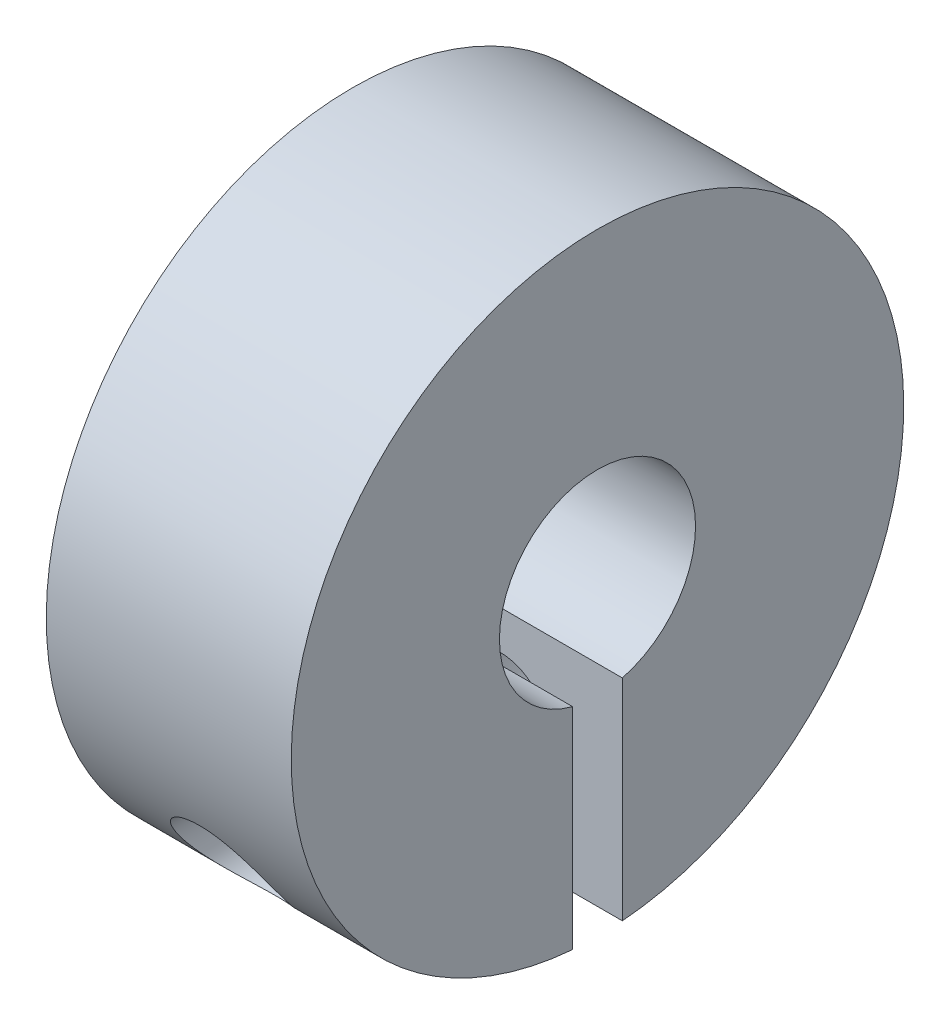
ISO-10303-21;
HEADER;
FILE_DESCRIPTION(('STEP AP214'),'2;1');
FILE_NAME('part.step','',(''),(''),'','','');
FILE_SCHEMA(('AUTOMOTIVE_DESIGN { 1 0 10303 214 1 1 1 1 }'));
ENDSEC;
DATA;
#1=APPLICATION_CONTEXT('core data for automotive mechanical design processes');
#2=APPLICATION_PROTOCOL_DEFINITION('international standard','automotive_design',2000,#1);
#3=PRODUCT_CONTEXT('',#1,'mechanical');
#4=PRODUCT('Part','Part','',(#3));
#5=PRODUCT_RELATED_PRODUCT_CATEGORY('part','',(#4));
#6=PRODUCT_DEFINITION_FORMATION('','',#4);
#7=PRODUCT_DEFINITION_CONTEXT('part definition',#1,'design');
#8=PRODUCT_DEFINITION('design','',#6,#7);
#9=PRODUCT_DEFINITION_SHAPE('','',#8);
#10=(LENGTH_UNIT() NAMED_UNIT(*) SI_UNIT(.MILLI.,.METRE.));
#11=(NAMED_UNIT(*) PLANE_ANGLE_UNIT() SI_UNIT($,.RADIAN.));
#12=(NAMED_UNIT(*) SI_UNIT($,.STERADIAN.) SOLID_ANGLE_UNIT());
#13=UNCERTAINTY_MEASURE_WITH_UNIT(LENGTH_MEASURE(1.E-05),#10,'distance_accuracy_value','');
#14=(GEOMETRIC_REPRESENTATION_CONTEXT(3) GLOBAL_UNCERTAINTY_ASSIGNED_CONTEXT((#13)) GLOBAL_UNIT_ASSIGNED_CONTEXT((#10,
#11,#12)) REPRESENTATION_CONTEXT('',''));
#15=CARTESIAN_POINT('',(0.,0.,0.));
#16=DIRECTION('',(0.,0.,1.));
#17=DIRECTION('',(1.,0.,0.));
#18=AXIS2_PLACEMENT_3D('',#15,#16,#17);
#19=CARTESIAN_POINT('',(51.5000099997895,-253.871175163599,-482.846759050819));
#20=DIRECTION('',(-3.8208128042193E-13,0.,-1.));
#21=DIRECTION('',(1.,0.,-3.8208128042193E-13));
#22=AXIS2_PLACEMENT_3D('',#19,#20,#21);
#23=PLANE('',#22);
#24=CARTESIAN_POINT('',(56.5000099997896,-257.458692421678,-482.846759050821));
#25=DIRECTION('',(3.8208128042193E-13,0.,1.));
#26=DIRECTION('',(1.,0.,-3.8208128042193E-13));
#27=AXIS2_PLACEMENT_3D('',#24,#25,#26);
#28=CIRCLE('',#27,2.);
#29=CARTESIAN_POINT('',(58.5000099997896,-257.458692421678,-482.846759050822));
#30=VERTEX_POINT('',#29);
#31=EDGE_CURVE('E102',#30,#30,#28,.T.);
#32=ORIENTED_EDGE('',*,*,#31,.F.);
#33=EDGE_LOOP('',(#32));
#34=FACE_BOUND('',#33,.T.);
#35=DIRECTION('',(0.,-1.,0.));
#36=VECTOR('',#35,1.);
#37=CARTESIAN_POINT('',(61.5000099997895,-253.871175163599,-482.846759050823));
#38=LINE('',#37,#36);
#39=CARTESIAN_POINT('',(61.5000099997895,-253.871175163599,-482.846759050823));
#40=VERTEX_POINT('',#39);
#41=CARTESIAN_POINT('',(61.5000099997895,-262.458692421678,-482.846759050823));
#42=VERTEX_POINT('',#41);
#43=EDGE_CURVE('E99',#40,#42,#38,.T.);
#44=ORIENTED_EDGE('',*,*,#43,.F.);
#45=DIRECTION('',(1.,0.,-3.8208128042193E-13));
#46=VECTOR('',#45,1.);
#47=CARTESIAN_POINT('',(51.5000099997895,-253.871175163599,-482.846759050819));
#48=LINE('',#47,#46);
#49=CARTESIAN_POINT('',(51.5000099997895,-253.871175163599,-482.846759050819));
#50=VERTEX_POINT('',#49);
#51=EDGE_CURVE('E98',#50,#40,#48,.T.);
#52=ORIENTED_EDGE('',*,*,#51,.F.);
#53=DIRECTION('',(0.,-1.,0.));
#54=VECTOR('',#53,1.);
#55=CARTESIAN_POINT('',(51.5000099997895,-253.871175163599,-482.846759050819));
#56=LINE('',#55,#54);
#57=CARTESIAN_POINT('',(51.5000099997895,-262.458692421678,-482.846759050819));
#58=VERTEX_POINT('',#57);
#59=EDGE_CURVE('E92',#50,#58,#56,.T.);
#60=ORIENTED_EDGE('',*,*,#59,.T.);
#61=DIRECTION('',(1.,0.,-3.8208128042193E-13));
#62=VECTOR('',#61,1.);
#63=CARTESIAN_POINT('',(51.5000099997895,-262.458692421678,-482.846759050819));
#64=LINE('',#63,#62);
#65=EDGE_CURVE('E11',#58,#42,#64,.T.);
#66=ORIENTED_EDGE('',*,*,#65,.T.);
#67=EDGE_LOOP('',(#44,#52,#60,#66));
#68=FACE_BOUND('',#67,.T.);
#69=ADVANCED_FACE('F33',(#34,#68),#23,.F.);
#70=CARTESIAN_POINT('',(51.50000999979,-249.999999999978,-481.831385650802));
#71=DIRECTION('',(1.,0.,-3.8208128042193E-13));
#72=DIRECTION('',(3.8208128042193E-13,0.,1.));
#73=AXIS2_PLACEMENT_3D('',#70,#71,#72);
#74=CYLINDRICAL_SURFACE('',#73,12.5);
#75=CARTESIAN_POINT('',(58.5000099997939,-257.458692421678,-471.800537862185));
#76=CARTESIAN_POINT('',(58.5000091417753,-257.32202750186,-471.698923568416));
#77=CARTESIAN_POINT('',(58.4860098511298,-257.183085527309,-471.599985504261));
#78=CARTESIAN_POINT('',(58.4272314805146,-256.905626388847,-471.410710924294));
#79=CARTESIAN_POINT('',(58.3824573498908,-256.767109160224,-471.320373028025));
#80=CARTESIAN_POINT('',(58.2764477658024,-256.533454967331,-471.174103158506));
#81=CARTESIAN_POINT('',(58.2227808496656,-256.436596202806,-471.115418564901));
#82=CARTESIAN_POINT('',(58.0976314885378,-256.250319013153,-471.005714397012));
#83=CARTESIAN_POINT('',(58.0261640770913,-256.160894394035,-470.954688412575));
#84=CARTESIAN_POINT('',(57.8656051149837,-255.99283578956,-470.861187381588));
#85=CARTESIAN_POINT('',(57.7764061259611,-255.91427279518,-470.818767815094));
#86=CARTESIAN_POINT('',(57.5826451757249,-255.772791423573,-470.743946248593));
#87=CARTESIAN_POINT('',(57.4780897521506,-255.709866419379,-470.711540003783));
#88=CARTESIAN_POINT('',(57.269232274307,-255.609308396691,-470.660508551465));
#89=CARTESIAN_POINT('',(57.1661783788679,-255.56964918884,-470.640756370137));
#90=CARTESIAN_POINT('',(56.9537312733238,-255.507703469025,-470.610137318958));
#91=CARTESIAN_POINT('',(56.844341421523,-255.485407842596,-470.599265787343));
#92=CARTESIAN_POINT('',(56.631117869176,-255.460324437699,-470.58705234907));
#93=CARTESIAN_POINT('',(56.5274747247753,-255.456211077353,-470.585062782987));
#94=CARTESIAN_POINT('',(56.3209539343082,-255.464047289617,-470.588867791854));
#95=CARTESIAN_POINT('',(56.2180761357273,-255.475993570766,-470.594660771753));
#96=CARTESIAN_POINT('',(56.0180950900692,-255.51500120303,-470.613756063819));
#97=CARTESIAN_POINT('',(55.9209179814628,-255.541759890797,-470.626908064747));
#98=CARTESIAN_POINT('',(55.7327750524551,-255.609007942336,-470.660421861223));
#99=CARTESIAN_POINT('',(55.6418094728308,-255.649497838007,-470.680783936064));
#100=CARTESIAN_POINT('',(55.4660780210098,-255.74370756196,-470.729012917671));
#101=CARTESIAN_POINT('',(55.38152586777,-255.797734780769,-470.757055846939));
#102=CARTESIAN_POINT('',(55.2229928280195,-255.916280975572,-470.819931908011));
#103=CARTESIAN_POINT('',(55.1490142886256,-255.980802274253,-470.854766543383));
#104=CARTESIAN_POINT('',(55.0079799384149,-256.122821681743,-470.933308989079));
#105=CARTESIAN_POINT('',(54.9417749575644,-256.200912863621,-470.977468095414));
#106=CARTESIAN_POINT('',(54.8234148387173,-256.363628260348,-471.07205943408));
#107=CARTESIAN_POINT('',(54.7712652880553,-256.448255056098,-471.122494149488));
#108=CARTESIAN_POINT('',(54.6756953108948,-256.631766981502,-471.235039235685));
#109=CARTESIAN_POINT('',(54.6340394411223,-256.731153961178,-471.297824982406));
#110=CARTESIAN_POINT('',(54.5677244243832,-256.931938109507,-471.428855110455));
#111=CARTESIAN_POINT('',(54.5430740192749,-257.033336284528,-471.497102279204));
#112=CARTESIAN_POINT('',(54.5071593259579,-257.252023983466,-471.649118093109));
#113=CARTESIAN_POINT('',(54.4986721860862,-257.369256965199,-471.733621761809));
#114=CARTESIAN_POINT('',(54.5016911665669,-257.600537186673,-471.906530751848));
#115=CARTESIAN_POINT('',(54.5132112877103,-257.714582138726,-471.994938763193));
#116=CARTESIAN_POINT('',(54.5583968947914,-257.956430064947,-472.189127375944));
#117=CARTESIAN_POINT('',(54.5954939309582,-258.083276319789,-472.295306486384));
#118=CARTESIAN_POINT('',(54.693723288699,-258.327407813512,-472.507734003267));
#119=CARTESIAN_POINT('',(54.7548729855533,-258.444686066499,-472.613982404247));
#120=CARTESIAN_POINT('',(54.8932554725917,-258.655589446186,-472.811990329934));
#121=CARTESIAN_POINT('',(54.9681583969234,-258.750406121279,-472.90410861533));
#122=CARTESIAN_POINT('',(55.1375874406156,-258.927988889587,-473.081718657772));
#123=CARTESIAN_POINT('',(55.2320785273331,-259.010776053522,-473.167221875742));
#124=CARTESIAN_POINT('',(55.4077291353196,-259.136338070992,-473.300101003534));
#125=CARTESIAN_POINT('',(55.4832782688354,-259.183383251079,-473.350850578455));
#126=CARTESIAN_POINT('',(55.6440058489859,-259.268525661478,-473.443990869609));
#127=CARTESIAN_POINT('',(55.7291690355996,-259.306636784665,-473.486394547405));
#128=CARTESIAN_POINT('',(55.8902537221288,-259.364989334839,-473.551983005074));
#129=CARTESIAN_POINT('',(55.9645399648477,-259.387287961737,-473.577321952482));
#130=CARTESIAN_POINT('',(56.1176829205151,-259.423379364409,-473.618549375535));
#131=CARTESIAN_POINT('',(56.1965351303795,-259.437180369577,-473.634446993961));
#132=CARTESIAN_POINT('',(56.3573046323965,-259.455242000412,-473.65528619151));
#133=CARTESIAN_POINT('',(56.4392379635055,-259.459442635311,-473.660158876176));
#134=CARTESIAN_POINT('',(56.6028534164668,-259.457720951801,-473.658166218334));
#135=CARTESIAN_POINT('',(56.6845355429826,-259.451798822465,-473.651301095065));
#136=CARTESIAN_POINT('',(56.8373657164028,-259.431401677319,-473.627797097343));
#137=CARTESIAN_POINT('',(56.9087852653994,-259.417776799008,-473.612130562749));
#138=CARTESIAN_POINT('',(57.0477124263677,-259.383568707314,-473.573098229434));
#139=CARTESIAN_POINT('',(57.1152182342316,-259.362982314309,-473.549728912645));
#140=CARTESIAN_POINT('',(57.2758408777509,-259.304875685092,-473.48441248162));
#141=CARTESIAN_POINT('',(57.3662595413503,-259.26393315198,-473.438880645324));
#142=CARTESIAN_POINT('',(57.5362488405394,-259.172050583107,-473.338556669739));
#143=CARTESIAN_POINT('',(57.6157913386997,-259.121085417753,-473.283741302958));
#144=CARTESIAN_POINT('',(57.7955104952811,-258.988045326552,-473.143587762987));
#145=CARTESIAN_POINT('',(57.8902385597968,-258.901915849866,-473.055127647163));
#146=CARTESIAN_POINT('',(58.0592851701801,-258.71739937535,-472.871811808776));
#147=CARTESIAN_POINT('',(58.1335734454246,-258.618994507985,-472.776946856866));
#148=CARTESIAN_POINT('',(58.264195682916,-258.409151790957,-472.581665019796));
#149=CARTESIAN_POINT('',(58.31991464894,-258.297408513994,-472.481167031412));
#150=CARTESIAN_POINT('',(58.4097211650104,-258.065647817923,-472.28053584157));
#151=CARTESIAN_POINT('',(58.4438584852535,-257.945650149054,-472.180402334184));
#152=CARTESIAN_POINT('',(58.4776102461563,-257.763219439608,-472.034026517163));
#153=CARTESIAN_POINT('',(58.4859478826733,-257.703149669856,-471.986724465113));
#154=CARTESIAN_POINT('',(58.4971507933033,-257.581773291734,-471.892944701655));
#155=CARTESIAN_POINT('',(58.5000103876214,-257.520465466172,-471.84646789528));
#156=CARTESIAN_POINT('',(58.5000099997939,-257.458692421678,-471.800537862185));
#157=B_SPLINE_CURVE_WITH_KNOTS('',3,(#75,#76,#77,#78,#79,#80,#81,#82,#83,#84,#85,#86,#87,#88,
#89,#90,#91,#92,#93,#94,#95,#96,#97,#98,#99,#100,#101,#102,#103,#104,#105,#106,#107,#108,#109,
#110,#111,#112,#113,#114,#115,#116,#117,#118,#119,#120,#121,#122,#123,#124,#125,#126,#127,#128,
#129,#130,#131,#132,#133,#134,#135,#136,#137,#138,#139,#140,#141,#142,#143,#144,#145,#146,#147,
#148,#149,#150,#151,#152,#153,#154,#155,#156),.UNSPECIFIED.,.T.,.F.,(4,2,2,2,2,2,2,2,2,2,2,2,2,
2,2,2,2,2,2,2,2,2,2,2,2,2,2,2,2,2,2,2,2,2,2,2,2,2,2,2,4),(0.,0.510595933998932,1.02110977090785,
1.39555096892262,1.76967699574349,2.14614308101336,2.52244935682085,2.8571818867016,
3.1917385906347,3.50145360522233,3.81110515264676,4.1146513943579,4.4182093957379,
4.72940916286737,5.04067790277657,5.37380283688312,5.70706000062246,6.07977428795344,
6.45268003094196,6.88532638521948,7.31827562114365,7.82482075767459,8.33173248880593,
8.78599883055408,9.23945963796568,9.54589960599778,9.85185983678663,10.095688047506,
10.33927975355,10.5843895010874,10.8294946705381,11.0517162578406,11.2740394806802,
11.59980790535,11.9264037845054,12.3907596332326,12.8557995200466,13.3349876046524,
13.8130665464247,14.0436188650954,14.2744100980709),.UNSPECIFIED.);
#158=CARTESIAN_POINT('',(58.5000099997939,-257.458692421678,-471.800537862185));
#159=VERTEX_POINT('',#158);
#160=EDGE_CURVE('E131',#159,#159,#157,.T.);
#161=ORIENTED_EDGE('',*,*,#160,.F.);
#162=EDGE_LOOP('',(#161));
#163=FACE_BOUND('',#162,.T.);
#164=CARTESIAN_POINT('',(58.5000099997862,-257.458692421678,-491.862233439425));
#165=CARTESIAN_POINT('',(58.5000092241441,-257.594612979212,-491.761161349616));
#166=CARTESIAN_POINT('',(58.4861645589352,-257.728496833762,-491.657281601874));
#167=CARTESIAN_POINT('',(58.4330195186562,-257.988983700948,-491.446703810788));
#168=CARTESIAN_POINT('',(58.3936726046819,-258.115572940876,-491.340000957718));
#169=CARTESIAN_POINT('',(58.2876565848293,-258.36642972549,-491.120208281879));
#170=CARTESIAN_POINT('',(58.2194539448289,-258.49007406963,-491.007129849409));
#171=CARTESIAN_POINT('',(58.0970615000155,-258.664705436754,-490.841346072942));
#172=CARTESIAN_POINT('',(58.0529256684126,-258.721100876681,-490.786733258574));
#173=CARTESIAN_POINT('',(57.957795593385,-258.829851492341,-490.679522841256));
#174=CARTESIAN_POINT('',(57.9068050007792,-258.88220879557,-490.626924184604));
#175=CARTESIAN_POINT('',(57.7824843761493,-258.996301353467,-490.51037910067));
#176=CARTESIAN_POINT('',(57.706893716237,-259.056568071791,-490.447369545237));
#177=CARTESIAN_POINT('',(57.5436757684498,-259.167632021579,-490.329096010568));
#178=CARTESIAN_POINT('',(57.456069838474,-259.218445686968,-490.273818631431));
#179=CARTESIAN_POINT('',(57.2907327040703,-259.297459316224,-490.186616005215));
#180=CARTESIAN_POINT('',(57.2155051843816,-259.328167865134,-490.152254551573));
#181=CARTESIAN_POINT('',(57.0585681720573,-259.380890497151,-490.092770372724));
#182=CARTESIAN_POINT('',(56.9768642306189,-259.402911931588,-490.067639837248));
#183=CARTESIAN_POINT('',(56.8077267096394,-259.436774388242,-490.028823072283));
#184=CARTESIAN_POINT('',(56.7202429445752,-259.448508640724,-490.015256907436));
#185=CARTESIAN_POINT('',(56.543470355972,-259.4601749741,-490.001770229398));
#186=CARTESIAN_POINT('',(56.4541833116823,-259.460118169728,-490.001836865368));
#187=CARTESIAN_POINT('',(56.2910445831916,-259.449165318178,-490.014496985118));
#188=CARTESIAN_POINT('',(56.2169166861941,-259.43992467803,-490.02517730194));
#189=CARTESIAN_POINT('',(56.0718829745959,-259.413723067638,-490.055266388906));
#190=CARTESIAN_POINT('',(56.0009789692108,-259.396757819828,-490.07467999511));
#191=CARTESIAN_POINT('',(55.8406694646281,-259.349301561223,-490.128507076393));
#192=CARTESIAN_POINT('',(55.7530038499504,-259.316184792607,-490.165765477591));
#193=CARTESIAN_POINT('',(55.5868108938031,-259.240392085,-490.249720667535));
#194=CARTESIAN_POINT('',(55.5083032048074,-259.197696142994,-490.296437186289));
#195=CARTESIAN_POINT('',(55.3293115780161,-259.085007449547,-490.417537600321));
#196=CARTESIAN_POINT('',(55.2335690089077,-259.011105709656,-490.495268516866));
#197=CARTESIAN_POINT('',(55.0599486294664,-258.851588125705,-490.658190857872));
#198=CARTESIAN_POINT('',(54.9821025333516,-258.76595190905,-490.743395162441));
#199=CARTESIAN_POINT('',(54.824752351275,-258.560716537552,-490.941242859089));
#200=CARTESIAN_POINT('',(54.7505151798802,-258.438202370055,-491.055065154623));
#201=CARTESIAN_POINT('',(54.6296590314289,-258.181156756184,-491.283811263187));
#202=CARTESIAN_POINT('',(54.5830563523201,-258.046618271961,-491.3987356857));
#203=CARTESIAN_POINT('',(54.5188752089262,-257.767932566839,-491.626369725989));
#204=CARTESIAN_POINT('',(54.5014196527823,-257.623747309371,-491.739067994381));
#205=CARTESIAN_POINT('',(54.4987689335428,-257.330364976135,-491.958036994962));
#206=CARTESIAN_POINT('',(54.5135164226631,-257.181177274738,-492.064318807273));
#207=CARTESIAN_POINT('',(54.5702913084127,-256.920898536882,-492.241451589227));
#208=CARTESIAN_POINT('',(54.6045721627613,-256.809612673347,-492.314515177063));
#209=CARTESIAN_POINT('',(54.6942022328724,-256.590939615365,-492.453354996605));
#210=CARTESIAN_POINT('',(54.7495429552383,-256.483550868319,-492.519134152317));
#211=CARTESIAN_POINT('',(54.88225725378,-256.276266773931,-492.642173258146));
#212=CARTESIAN_POINT('',(54.9597966958605,-256.176435274431,-492.699363937967));
#213=CARTESIAN_POINT('',(55.1358717600212,-255.990541929676,-492.802928092832));
#214=CARTESIAN_POINT('',(55.2343903351086,-255.90446900345,-492.849310286813));
#215=CARTESIAN_POINT('',(55.4350016896963,-255.761994487003,-492.924402982716));
#216=CARTESIAN_POINT('',(55.5347828293463,-255.703148911101,-492.95465950634));
#217=CARTESIAN_POINT('',(55.7450549093446,-255.603007189056,-493.005439758088));
#218=CARTESIAN_POINT('',(55.8555377460036,-255.561697889483,-493.025970782359));
#219=CARTESIAN_POINT('',(56.0711279418383,-255.50236812812,-493.055240625056));
#220=CARTESIAN_POINT('',(56.1755449975829,-255.482328266852,-493.065006377169));
#221=CARTESIAN_POINT('',(56.3866640675213,-255.459088569242,-493.076319096205));
#222=CARTESIAN_POINT('',(56.4933652681626,-255.455882834026,-493.077868942079));
#223=CARTESIAN_POINT('',(56.701016740081,-255.466224222018,-493.072845314545));
#224=CARTESIAN_POINT('',(56.8020132649536,-255.479039459801,-493.066626735092));
#225=CARTESIAN_POINT('',(57.0001873189865,-255.519607536965,-493.046751780345));
#226=CARTESIAN_POINT('',(57.0973650869726,-255.547359440604,-493.033095870979));
#227=CARTESIAN_POINT('',(57.2857568208327,-255.616756246476,-492.99845994936));
#228=CARTESIAN_POINT('',(57.3769401685153,-255.658466707322,-492.977445353839));
#229=CARTESIAN_POINT('',(57.5506500363594,-255.753996866549,-492.928429939596));
#230=CARTESIAN_POINT('',(57.633175395906,-255.807818185373,-492.900428185931));
#231=CARTESIAN_POINT('',(57.7916968969979,-255.928354045681,-492.836361109974));
#232=CARTESIAN_POINT('',(57.8671795215357,-255.995568744818,-492.799969569492));
#233=CARTESIAN_POINT('',(58.0056287700488,-256.138457077918,-492.720647402235));
#234=CARTESIAN_POINT('',(58.0685911753601,-256.214133549685,-492.677714579966));
#235=CARTESIAN_POINT('',(58.1868672337333,-256.378986578049,-492.58166288548));
#236=CARTESIAN_POINT('',(58.2408699072182,-256.46876189192,-492.527962173618));
#237=CARTESIAN_POINT('',(58.3332160103405,-256.652501344389,-492.414669350666));
#238=CARTESIAN_POINT('',(58.3715534210045,-256.746467077698,-492.355074985995));
#239=CARTESIAN_POINT('',(58.4355920002004,-256.943782548546,-492.226041042675));
#240=CARTESIAN_POINT('',(58.4600206802795,-257.047276678616,-492.156195027571));
#241=CARTESIAN_POINT('',(58.4922335628695,-257.253792906537,-492.012170846256));
#242=CARTESIAN_POINT('',(58.5000105811596,-257.356814781516,-491.937990824348));
#243=CARTESIAN_POINT('',(58.5000099997862,-257.458692421678,-491.862233439425));
#244=B_SPLINE_CURVE_WITH_KNOTS('',3,(#164,#165,#166,#167,#168,#169,#170,#171,#172,#173,#174,
#175,#176,#177,#178,#179,#180,#181,#182,#183,#184,#185,#186,#187,#188,#189,#190,#191,#192,#193,
#194,#195,#196,#197,#198,#199,#200,#201,#202,#203,#204,#205,#206,#207,#208,#209,#210,#211,#212,
#213,#214,#215,#216,#217,#218,#219,#220,#221,#222,#223,#224,#225,#226,#227,#228,#229,#230,#231,
#232,#233,#234,#235,#236,#237,#238,#239,#240,#241,#242,#243),.UNSPECIFIED.,.T.,.F.,(4,2,2,2,2,2,
2,2,2,2,2,2,2,2,2,2,2,2,2,2,2,2,2,2,2,2,2,2,2,2,2,2,2,2,2,2,2,2,2,4),(0.,0.507704908639484,
1.01633894363083,1.55630011267262,1.82618375886346,2.09592423137957,2.44105049524315,
2.78557104018967,3.04928125629363,3.31276783066873,3.57895779120076,3.84489683128027,
4.07025318711584,4.29573448796369,4.59660160667346,4.89810293546614,5.32707159006807,
5.75679465611169,6.30296349898398,6.84945413538384,7.39824345764359,7.94605628276657,
8.356839278418,8.76745678149922,9.18122623199273,9.59466074053709,9.95182259031648,
10.3087160684015,10.6274109760263,10.9459942017819,11.2505410815092,11.5550688844134,
11.861047507322,12.1670670948026,12.4879860445191,12.8090129447161,13.1608004560404,
13.5127230058349,13.8931031135162,14.2736472999819),.UNSPECIFIED.);
#245=CARTESIAN_POINT('',(58.5000099997862,-257.458692421678,-491.862233439425));
#246=VERTEX_POINT('',#245);
#247=EDGE_CURVE('E133',#246,#246,#244,.T.);
#248=ORIENTED_EDGE('',*,*,#247,.F.);
#249=EDGE_LOOP('',(#248));
#250=FACE_BOUND('',#249,.T.);
#251=CARTESIAN_POINT('',(61.5000099997901,-249.999999999978,-481.831385650806));
#252=DIRECTION('',(1.,0.,-3.8208128042193E-13));
#253=DIRECTION('',(-3.8208128042193E-13,0.,-1.));
#254=AXIS2_PLACEMENT_3D('',#251,#252,#253);
#255=CIRCLE('',#254,12.5);
#256=CARTESIAN_POINT('',(61.5000099997903,-262.458692421678,-480.81601225079));
#257=VERTEX_POINT('',#256);
#258=EDGE_CURVE('E101',#42,#257,#255,.T.);
#259=ORIENTED_EDGE('',*,*,#258,.F.);
#260=ORIENTED_EDGE('',*,*,#65,.F.);
#261=CARTESIAN_POINT('',(51.50000999979,-249.999999999978,-481.831385650802));
#262=DIRECTION('',(1.,0.,-3.8208128042193E-13));
#263=DIRECTION('',(-3.8208128042193E-13,0.,-1.));
#264=AXIS2_PLACEMENT_3D('',#261,#262,#263);
#265=CIRCLE('',#264,12.5);
#266=CARTESIAN_POINT('',(51.5000099997903,-262.458692421678,-480.816012250786));
#267=VERTEX_POINT('',#266);
#268=EDGE_CURVE('E75',#58,#267,#265,.T.);
#269=ORIENTED_EDGE('',*,*,#268,.T.);
#270=DIRECTION('',(1.,0.,-3.8208128042193E-13));
#271=VECTOR('',#270,1.);
#272=CARTESIAN_POINT('',(51.5000099997903,-262.458692421678,-480.816012250786));
#273=LINE('',#272,#271);
#274=EDGE_CURVE('E42',#267,#257,#273,.T.);
#275=ORIENTED_EDGE('',*,*,#274,.T.);
#276=EDGE_LOOP('',(#259,#260,#269,#275));
#277=FACE_BOUND('',#276,.T.);
#278=ADVANCED_FACE('F90',(#163,#250,#277),#74,.T.);
#279=CARTESIAN_POINT('',(51.5000099997903,-253.871175163599,-480.816012250786));
#280=DIRECTION('',(-3.8208128042193E-13,0.,-1.));
#281=DIRECTION('',(1.,0.,-3.8208128042193E-13));
#282=AXIS2_PLACEMENT_3D('',#279,#280,#281);
#283=PLANE('',#282);
#284=CARTESIAN_POINT('',(56.5000099997904,-257.458692421678,-480.816012250788));
#285=DIRECTION('',(3.8208128042193E-13,0.,1.));
#286=DIRECTION('',(1.,0.,-3.8208128042193E-13));
#287=AXIS2_PLACEMENT_3D('',#284,#285,#286);
#288=CIRCLE('',#287,2.);
#289=CARTESIAN_POINT('',(58.5000099997904,-257.458692421678,-480.816012250789));
#290=VERTEX_POINT('',#289);
#291=EDGE_CURVE('E36',#290,#290,#288,.T.);
#292=ORIENTED_EDGE('',*,*,#291,.T.);
#293=EDGE_LOOP('',(#292));
#294=FACE_BOUND('',#293,.T.);
#295=DIRECTION('',(0.,-1.,0.));
#296=VECTOR('',#295,1.);
#297=CARTESIAN_POINT('',(61.5000099997903,-253.871175163599,-480.81601225079));
#298=LINE('',#297,#296);
#299=CARTESIAN_POINT('',(61.5000099997903,-253.871175163599,-480.81601225079));
#300=VERTEX_POINT('',#299);
#301=EDGE_CURVE('E85',#300,#257,#298,.T.);
#302=ORIENTED_EDGE('',*,*,#301,.T.);
#303=ORIENTED_EDGE('',*,*,#274,.F.);
#304=DIRECTION('',(0.,-1.,0.));
#305=VECTOR('',#304,1.);
#306=CARTESIAN_POINT('',(51.5000099997903,-253.871175163599,-480.816012250786));
#307=LINE('',#306,#305);
#308=CARTESIAN_POINT('',(51.5000099997903,-253.871175163599,-480.816012250786));
#309=VERTEX_POINT('',#308);
#310=EDGE_CURVE('E78',#309,#267,#307,.T.);
#311=ORIENTED_EDGE('',*,*,#310,.F.);
#312=DIRECTION('',(1.,0.,-3.8208128042193E-13));
#313=VECTOR('',#312,1.);
#314=CARTESIAN_POINT('',(51.5000099997903,-253.871175163599,-480.816012250786));
#315=LINE('',#314,#313);
#316=EDGE_CURVE('E88',#309,#300,#315,.T.);
#317=ORIENTED_EDGE('',*,*,#316,.T.);
#318=EDGE_LOOP('',(#302,#303,#311,#317));
#319=FACE_BOUND('',#318,.T.);
#320=ADVANCED_FACE('F84',(#294,#319),#283,.T.);
#321=CARTESIAN_POINT('',(51.50000999979,-249.999999999978,-481.831385650802));
#322=DIRECTION('',(1.,0.,-3.8208128042193E-13));
#323=DIRECTION('',(3.8208128042193E-13,0.,1.));
#324=AXIS2_PLACEMENT_3D('',#321,#322,#323);
#325=CYLINDRICAL_SURFACE('',#324,4.00212197326604);
#326=CARTESIAN_POINT('',(61.5000099997901,-249.999999999978,-481.831385650806));
#327=DIRECTION('',(1.,0.,-3.8208128042193E-13));
#328=DIRECTION('',(-3.8208128042193E-13,0.,-1.));
#329=AXIS2_PLACEMENT_3D('',#326,#327,#328);
#330=CIRCLE('',#329,4.00212197326604);
#331=EDGE_CURVE('E64',#40,#300,#330,.T.);
#332=ORIENTED_EDGE('',*,*,#331,.T.);
#333=ORIENTED_EDGE('',*,*,#316,.F.);
#334=CARTESIAN_POINT('',(51.50000999979,-249.999999999978,-481.831385650802));
#335=DIRECTION('',(1.,0.,-3.8208128042193E-13));
#336=DIRECTION('',(-3.8208128042193E-13,0.,-1.));
#337=AXIS2_PLACEMENT_3D('',#334,#335,#336);
#338=CIRCLE('',#337,4.00212197326604);
#339=EDGE_CURVE('E50',#50,#309,#338,.T.);
#340=ORIENTED_EDGE('',*,*,#339,.F.);
#341=ORIENTED_EDGE('',*,*,#51,.T.);
#342=EDGE_LOOP('',(#332,#333,#340,#341));
#343=FACE_BOUND('',#342,.T.);
#344=ADVANCED_FACE('F111',(#343),#325,.F.);
#345=CARTESIAN_POINT('',(51.50000999979,-249.999999999978,-481.831385650802));
#346=DIRECTION('',(-1.,0.,3.8208128042193E-13));
#347=DIRECTION('',(-3.8208128042193E-13,0.,-1.));
#348=AXIS2_PLACEMENT_3D('',#345,#346,#347);
#349=PLANE('',#348);
#350=ORIENTED_EDGE('',*,*,#59,.F.);
#351=ORIENTED_EDGE('',*,*,#339,.T.);
#352=ORIENTED_EDGE('',*,*,#310,.T.);
#353=ORIENTED_EDGE('',*,*,#268,.F.);
#354=EDGE_LOOP('',(#350,#351,#352,#353));
#355=FACE_BOUND('',#354,.T.);
#356=ADVANCED_FACE('F80',(#355),#349,.T.);
#357=CARTESIAN_POINT('',(61.5000099997901,-249.999999999978,-481.831385650806));
#358=DIRECTION('',(-1.,0.,3.8208128042193E-13));
#359=DIRECTION('',(-3.8208128042193E-13,0.,-1.));
#360=AXIS2_PLACEMENT_3D('',#357,#358,#359);
#361=PLANE('',#360);
#362=ORIENTED_EDGE('',*,*,#43,.T.);
#363=ORIENTED_EDGE('',*,*,#258,.T.);
#364=ORIENTED_EDGE('',*,*,#301,.F.);
#365=ORIENTED_EDGE('',*,*,#331,.F.);
#366=EDGE_LOOP('',(#362,#363,#364,#365));
#367=FACE_BOUND('',#366,.T.);
#368=ADVANCED_FACE('F107',(#367),#361,.F.);
#369=CARTESIAN_POINT('',(56.5000099998427,-257.458692421678,-343.831395650803));
#370=DIRECTION('',(-3.81916720471054E-13,0.,-1.));
#371=DIRECTION('',(1.,0.,-3.81916720471054E-13));
#372=AXIS2_PLACEMENT_3D('',#369,#370,#371);
#373=CYLINDRICAL_SURFACE('',#372,2.);
#374=ORIENTED_EDGE('',*,*,#291,.F.);
#375=EDGE_LOOP('',(#374));
#376=FACE_BOUND('',#375,.T.);
#377=ORIENTED_EDGE('',*,*,#160,.T.);
#378=EDGE_LOOP('',(#377));
#379=FACE_BOUND('',#378,.T.);
#380=ADVANCED_FACE('F148',(#376,#379),#373,.F.);
#381=ORIENTED_EDGE('',*,*,#247,.T.);
#382=EDGE_LOOP('',(#381));
#383=FACE_BOUND('',#382,.T.);
#384=ORIENTED_EDGE('',*,*,#31,.T.);
#385=EDGE_LOOP('',(#384));
#386=FACE_BOUND('',#385,.T.);
#387=ADVANCED_FACE('F143',(#383,#386),#373,.F.);
#388=CLOSED_SHELL('',(#69,#278,#320,#344,#356,#368,#380,#387));
#389=MANIFOLD_SOLID_BREP('B2',#388);
#390=ADVANCED_BREP_SHAPE_REPRESENTATION('',(#18,#389),#14);
#391=SHAPE_DEFINITION_REPRESENTATION(#9,#390);
ENDSEC;
END-ISO-10303-21;
